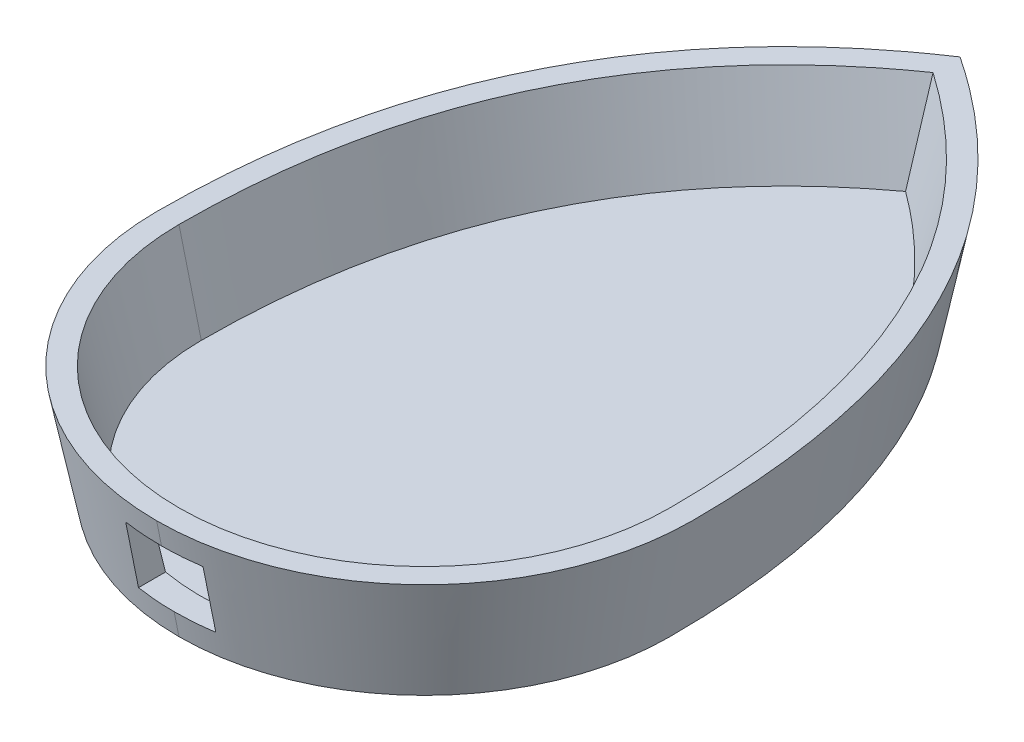
ISO-10303-21;
HEADER;
FILE_DESCRIPTION(('STEP AP214'),'2;1');
FILE_NAME('part.step','',(''),(''),'','','');
FILE_SCHEMA(('AUTOMOTIVE_DESIGN { 1 0 10303 214 1 1 1 1 }'));
ENDSEC;
DATA;
#1=APPLICATION_CONTEXT('core data for automotive mechanical design processes');
#2=APPLICATION_PROTOCOL_DEFINITION('international standard','automotive_design',2000,#1);
#3=PRODUCT_CONTEXT('',#1,'mechanical');
#4=PRODUCT('Part','Part','',(#3));
#5=PRODUCT_RELATED_PRODUCT_CATEGORY('part','',(#4));
#6=PRODUCT_DEFINITION_FORMATION('','',#4);
#7=PRODUCT_DEFINITION_CONTEXT('part definition',#1,'design');
#8=PRODUCT_DEFINITION('design','',#6,#7);
#9=PRODUCT_DEFINITION_SHAPE('','',#8);
#10=(LENGTH_UNIT() NAMED_UNIT(*) SI_UNIT(.MILLI.,.METRE.));
#11=(NAMED_UNIT(*) PLANE_ANGLE_UNIT() SI_UNIT($,.RADIAN.));
#12=(NAMED_UNIT(*) SI_UNIT($,.STERADIAN.) SOLID_ANGLE_UNIT());
#13=UNCERTAINTY_MEASURE_WITH_UNIT(LENGTH_MEASURE(1.E-05),#10,'distance_accuracy_value','');
#14=(GEOMETRIC_REPRESENTATION_CONTEXT(3) GLOBAL_UNCERTAINTY_ASSIGNED_CONTEXT((#13)) GLOBAL_UNIT_ASSIGNED_CONTEXT((#10,
#11,#12)) REPRESENTATION_CONTEXT('',''));
#15=CARTESIAN_POINT('',(0.,0.,0.));
#16=DIRECTION('',(0.,0.,1.));
#17=DIRECTION('',(1.,0.,0.));
#18=AXIS2_PLACEMENT_3D('',#15,#16,#17);
#19=CARTESIAN_POINT('',(0.,-15.875,0.));
#20=DIRECTION('',(0.,1.,0.));
#21=DIRECTION('',(0.,0.,1.));
#22=AXIS2_PLACEMENT_3D('',#19,#20,#21);
#23=PLANE('',#22);
#24=CARTESIAN_POINT('',(-34.9249999999417,-15.875,-4.7378043443898E-08));
#25=CARTESIAN_POINT('',(-34.9249999970583,-15.875,-8.0806599158788));
#26=CARTESIAN_POINT('',(-34.1867043705212,-15.875,-15.6296958282821));
#27=CARTESIAN_POINT('',(-31.2612453448167,-15.875,-29.6793205189885));
#28=CARTESIAN_POINT('',(-29.0752302143099,-15.875,-36.1800100734312));
#29=CARTESIAN_POINT('',(-23.2675325113024,-15.875,-48.1789765558001));
#30=CARTESIAN_POINT('',(-19.6460105934756,-15.875,-53.6789419478958));
#31=CARTESIAN_POINT('',(-10.9368083769806,-15.875,-63.7283287807617));
#32=CARTESIAN_POINT('',(-5.84752299816304,-15.875,-68.2783879064671));
#33=CARTESIAN_POINT('',(-4.37128631902706E-12,-15.875,-72.3587866568939));
#34=B_SPLINE_CURVE_WITH_KNOTS('',3,(#24,#25,#26,#27,#28,#29,#30,#31,#32,#33),.UNSPECIFIED.,.F.,
.F.,(4,2,2,2,4),(0.,0.25,0.5,0.75,1.),.UNSPECIFIED.);
#35=CARTESIAN_POINT('',(-34.924999999973,-15.875,-4.73900620286319E-08));
#36=VERTEX_POINT('',#35);
#37=CARTESIAN_POINT('',(2.69597712210246E-12,-15.875,-72.3587866568659));
#38=VERTEX_POINT('',#37);
#39=EDGE_CURVE('E467',#36,#38,#34,.T.);
#40=ORIENTED_EDGE('',*,*,#39,.T.);
#41=CARTESIAN_POINT('',(2.69597712210246E-12,-15.875,-72.3587866568659));
#42=CARTESIAN_POINT('',(5.84752299816165,-15.875,-68.2783879064392));
#43=CARTESIAN_POINT('',(10.9368083769786,-15.875,-63.7283287807344));
#44=CARTESIAN_POINT('',(19.6460105934742,-15.875,-53.6789419478686));
#45=CARTESIAN_POINT('',(23.2675325113017,-15.875,-48.1789765558013));
#46=CARTESIAN_POINT('',(29.0752302143098,-15.875,-36.1800100734325));
#47=CARTESIAN_POINT('',(31.2612453448168,-15.875,-29.6793205190186));
#48=CARTESIAN_POINT('',(34.1867043705216,-15.875,-15.6296958283122));
#49=CARTESIAN_POINT('',(34.9249999970588,-15.875,-8.08065991588095));
#50=CARTESIAN_POINT('',(34.9249999999424,-15.875,-4.73801918062852E-08));
#51=B_SPLINE_CURVE_WITH_KNOTS('',3,(#41,#42,#43,#44,#45,#46,#47,#48,#49,#50),.UNSPECIFIED.,.F.,
.F.,(4,2,2,2,4),(0.,0.25,0.5,0.75,1.),.UNSPECIFIED.);
#52=CARTESIAN_POINT('',(34.924999999973,-15.875,-4.73801918063267E-08));
#53=VERTEX_POINT('',#52);
#54=EDGE_CURVE('E228',#38,#53,#51,.T.);
#55=ORIENTED_EDGE('',*,*,#54,.T.);
#56=CARTESIAN_POINT('',(0.,-15.875,0.));
#57=DIRECTION('',(0.,1.,0.));
#58=DIRECTION('',(0.,0.,1.));
#59=AXIS2_PLACEMENT_3D('',#56,#57,#58);
#60=CIRCLE('',#59,34.924999999973);
#61=CARTESIAN_POINT('',(1.05424084290932E-05,-15.875,34.9250694280044));
#62=VERTEX_POINT('',#61);
#63=EDGE_CURVE('E513',#62,#53,#60,.T.);
#64=ORIENTED_EDGE('',*,*,#63,.F.);
#65=EDGE_CURVE('E518',#36,#62,#60,.T.);
#66=ORIENTED_EDGE('',*,*,#65,.F.);
#67=EDGE_LOOP('',(#40,#55,#64,#66));
#68=FACE_BOUND('',#67,.T.);
#69=ADVANCED_FACE('F131',(#68),#23,.F.);
#70=CARTESIAN_POINT('',(0.,0.,0.));
#71=DIRECTION('',(0.,1.,0.));
#72=DIRECTION('',(0.,0.,1.));
#73=AXIS2_PLACEMENT_3D('',#70,#71,#72);
#74=PLANE('',#73);
#75=CARTESIAN_POINT('',(-34.9249999999417,0.,-4.7378043443898E-08));
#76=CARTESIAN_POINT('',(-34.9249999970583,0.,-8.0806599158788));
#77=CARTESIAN_POINT('',(-34.1867043705212,0.,-15.6296958282821));
#78=CARTESIAN_POINT('',(-31.2612453448167,0.,-29.6793205189885));
#79=CARTESIAN_POINT('',(-29.0752302143099,0.,-36.1800100734312));
#80=CARTESIAN_POINT('',(-23.2675325113024,0.,-48.1789765558001));
#81=CARTESIAN_POINT('',(-19.6460105934756,0.,-53.6789419478958));
#82=CARTESIAN_POINT('',(-10.9368083769806,0.,-63.7283287807617));
#83=CARTESIAN_POINT('',(-5.84752299816304,0.,-68.2783879064671));
#84=CARTESIAN_POINT('',(-4.37128631902706E-12,0.,-72.3587866568939));
#85=B_SPLINE_CURVE_WITH_KNOTS('',3,(#75,#76,#77,#78,#79,#80,#81,#82,#83,#84),.UNSPECIFIED.,.F.,
.F.,(4,2,2,2,4),(0.,0.25,0.5,0.75,1.),.UNSPECIFIED.);
#86=CARTESIAN_POINT('',(-34.9249999999417,0.,-4.7378043443898E-08));
#87=VERTEX_POINT('',#86);
#88=CARTESIAN_POINT('',(2.69597712210246E-12,0.,-72.3587866568659));
#89=VERTEX_POINT('',#88);
#90=EDGE_CURVE('E365',#87,#89,#85,.T.);
#91=ORIENTED_EDGE('',*,*,#90,.T.);
#92=CARTESIAN_POINT('',(2.69597712210246E-12,0.,-72.3587866568659));
#93=CARTESIAN_POINT('',(5.84752299816165,0.,-68.2783879064392));
#94=CARTESIAN_POINT('',(10.9368083769786,0.,-63.7283287807344));
#95=CARTESIAN_POINT('',(19.6460105934742,0.,-53.6789419478686));
#96=CARTESIAN_POINT('',(23.2675325113017,0.,-48.1789765558013));
#97=CARTESIAN_POINT('',(29.0752302143098,0.,-36.1800100734325));
#98=CARTESIAN_POINT('',(31.2612453448168,0.,-29.6793205190186));
#99=CARTESIAN_POINT('',(34.1867043705216,0.,-15.6296958283122));
#100=CARTESIAN_POINT('',(34.9249999970588,0.,-8.08065991588095));
#101=CARTESIAN_POINT('',(34.9249999999424,0.,-4.73801918062852E-08));
#102=B_SPLINE_CURVE_WITH_KNOTS('',3,(#92,#93,#94,#95,#96,#97,#98,#99,#100,#101),.UNSPECIFIED.,
.F.,.F.,(4,2,2,2,4),(0.,0.25,0.5,0.75,1.),.UNSPECIFIED.);
#103=CARTESIAN_POINT('',(34.9250000013396,0.,-4.73801895202763E-08));
#104=VERTEX_POINT('',#103);
#105=EDGE_CURVE('E557',#89,#104,#102,.T.);
#106=ORIENTED_EDGE('',*,*,#105,.T.);
#107=CARTESIAN_POINT('',(0.,0.,0.));
#108=DIRECTION('',(0.,1.,0.));
#109=DIRECTION('',(0.,0.,1.));
#110=AXIS2_PLACEMENT_3D('',#107,#108,#109);
#111=CIRCLE('',#110,34.9249999999708);
#112=EDGE_CURVE('E369',#87,#104,#111,.T.);
#113=ORIENTED_EDGE('',*,*,#112,.F.);
#114=EDGE_LOOP('',(#91,#106,#113));
#115=FACE_BOUND('',#114,.T.);
#116=CARTESIAN_POINT('',(-38.1,0.,0.));
#117=CARTESIAN_POINT('',(-38.0999999999907,0.,-50.8720010197353));
#118=CARTESIAN_POINT('',(0.,0.,-76.2));
#119=B_SPLINE_CURVE_WITH_KNOTS('',2,(#116,#117,#118),.UNSPECIFIED.,.F.,.F.,(3,3),(0.,1.),.UNSPECIFIED.);
#120=CARTESIAN_POINT('',(-38.1,0.,0.));
#121=VERTEX_POINT('',#120);
#122=CARTESIAN_POINT('',(0.,0.,-76.2));
#123=VERTEX_POINT('',#122);
#124=EDGE_CURVE('E391',#121,#123,#119,.T.);
#125=ORIENTED_EDGE('',*,*,#124,.F.);
#126=CARTESIAN_POINT('',(0.,0.,0.));
#127=DIRECTION('',(0.,1.,0.));
#128=DIRECTION('',(0.,0.,1.));
#129=AXIS2_PLACEMENT_3D('',#126,#127,#128);
#130=CIRCLE('',#129,38.1);
#131=CARTESIAN_POINT('',(-1.16447508189885E-05,0.,38.1000826117498));
#132=VERTEX_POINT('',#131);
#133=EDGE_CURVE('E435',#121,#132,#130,.T.);
#134=ORIENTED_EDGE('',*,*,#133,.T.);
#135=CARTESIAN_POINT('',(38.1,0.,0.));
#136=VERTEX_POINT('',#135);
#137=EDGE_CURVE('E431',#132,#136,#130,.T.);
#138=ORIENTED_EDGE('',*,*,#137,.T.);
#139=CARTESIAN_POINT('',(38.1,0.,0.));
#140=CARTESIAN_POINT('',(38.0999999999907,0.,-50.8720010197353));
#141=CARTESIAN_POINT('',(0.,0.,-76.2));
#142=B_SPLINE_CURVE_WITH_KNOTS('',2,(#139,#140,#141),.UNSPECIFIED.,.F.,.F.,(3,3),(0.,1.),.UNSPECIFIED.);
#143=EDGE_CURVE('E438',#136,#123,#142,.T.);
#144=ORIENTED_EDGE('',*,*,#143,.T.);
#145=EDGE_LOOP('',(#125,#134,#138,#144));
#146=FACE_BOUND('',#145,.T.);
#147=ADVANCED_FACE('F293',(#115,#146),#74,.T.);
#148=CARTESIAN_POINT('',(-1.16447508189885E-05,0.,38.1000826117498));
#149=CARTESIAN_POINT('',(1.05424084290932E-05,-15.875,34.9250694280044));
#150=CARTESIAN_POINT('',(-2.5006763266818,0.,38.1000818475055));
#151=CARTESIAN_POINT('',(-2.2793612818631,-15.875,34.9250701160121));
#152=CARTESIAN_POINT('',(-7.50200541410691,0.,37.6060478398604));
#153=CARTESIAN_POINT('',(-6.83810517586723,-15.875,34.47739058703));
#154=CARTESIAN_POINT('',(-14.7121354004322,0.,35.4123242086588));
#155=CARTESIAN_POINT('',(-13.4166571822769,-15.875,32.4877802144078));
#156=CARTESIAN_POINT('',(-21.3505349515148,0.,31.8529341765999));
#157=CARTESIAN_POINT('',(-19.485401622336,-15.875,29.2541060853564));
#158=CARTESIAN_POINT('',(-27.1606563057038,0.,27.0687496488763));
#159=CARTESIAN_POINT('',(-24.8123902609882,-15.875,24.896940942448));
#160=CARTESIAN_POINT('',(-31.9198698056499,0.,21.2484943818256));
#161=CARTESIAN_POINT('',(-29.1925294234042,-15.875,19.5792651114903));
#162=CARTESIAN_POINT('',(-35.4478753605464,0.,14.6206989560948));
#163=CARTESIAN_POINT('',(-32.4549102472117,-15.875,13.5008883926727));
#164=CARTESIAN_POINT('',(-37.6144093224181,0.,7.44422045676078));
#165=CARTESIAN_POINT('',(-34.4697575355005,-15.875,6.89145456004415));
#166=CARTESIAN_POINT('',(-38.1,0.,2.47966981217265));
#167=CARTESIAN_POINT('',(-34.9250000030923,-15.875,2.29884491137398));
#168=CARTESIAN_POINT('',(-38.0999999999993,0.,-3.74024455626681));
#169=CARTESIAN_POINT('',(-34.9249999987044,-15.875,-3.46749016184549));
#170=CARTESIAN_POINT('',(-37.7915670600429,0.,-11.2113587655299));
#171=CARTESIAN_POINT('',(-34.6535709504633,-15.875,-10.4161971714796));
#172=CARTESIAN_POINT('',(-36.2523479356984,0.,-22.2784776192415));
#173=CARTESIAN_POINT('',(-33.2836840678143,-15.875,-20.7924072190926));
#174=CARTESIAN_POINT('',(-33.4852882023996,0.,-33.094616262399));
#175=CARTESIAN_POINT('',(-30.7997320887285,-15.875,-30.989670868036));
#176=CARTESIAN_POINT('',(-29.3695733379445,0.,-43.4501477878273));
#177=CARTESIAN_POINT('',(-27.0726196112731,-15.875,-40.8244945735413));
#178=CARTESIAN_POINT('',(-23.8613940974803,0.,-53.1339994359898));
#179=CARTESIAN_POINT('',(-22.0446121700157,-15.875,-50.0776306073177));
#180=CARTESIAN_POINT('',(-17.0273947450351,0.,-61.9264738868761));
#181=CARTESIAN_POINT('',(-15.7600058866834,-15.875,-58.531443293637));
#182=CARTESIAN_POINT('',(-9.03801875405662,0.,-69.6886258517783));
#183=CARTESIAN_POINT('',(-8.37585996202627,-15.875,-66.0334188936042));
#184=CARTESIAN_POINT('',(-3.0915217248225,0.,-74.1448278453074));
#185=CARTESIAN_POINT('',(-2.86494956965829,-15.875,-70.3596262178956));
#186=CARTESIAN_POINT('',(0.,0.,-76.2));
#187=CARTESIAN_POINT('',(-4.37128631902706E-12,-15.875,-72.3587866568939));
#188=B_SPLINE_SURFACE_WITH_KNOTS('',3,1,((#148,#149),(#150,#151),(#152,#153),(#154,#155),(#156,
#157),(#158,#159),(#160,#161),(#162,#163),(#164,#165),(#166,#167),(#168,#169),(#170,#171),(#172,
#173),(#174,#175),(#176,#177),(#178,#179),(#180,#181),(#182,#183),(#184,#185),(#186,#187)),
.UNSPECIFIED.,.F.,.F.,.F.,(4,1,1,1,1,1,1,1,2,1,1,1,1,1,1,1,4),(2,2),(0.499999730145373,
0.524916422345061,0.54983311454475,0.574749806744438,0.599666498944127,0.624583191143815,
0.649499883343504,0.674416575543193,0.699333267742881,0.736916609275021,0.774499950807161,
0.812083292339301,0.84966663387144,0.88724997540358,0.92483331693572,0.96241665846786,1.),(0.,
1.),.UNSPECIFIED.);
#189=CARTESIAN_POINT('',(-6.82856494378286E-06,-3.44599999999999,37.4108797499428));
#190=CARTESIAN_POINT('',(-0.184246986337074,-3.44599999999999,37.4108797165838));
#191=CARTESIAN_POINT('',(-0.368487084724106,-3.44599999999999,37.4095141743059));
#192=CARTESIAN_POINT('',(-0.736766661582786,-3.44599999999999,37.404058473425));
#193=CARTESIAN_POINT('',(-0.920806175170771,-3.44599999999999,37.3999706856272));
#194=CARTESIAN_POINT('',(-1.288684886784,-3.44599999999999,37.3890804262643));
#195=CARTESIAN_POINT('',(-1.47252413720962,-3.44599999999999,37.382279724308));
#196=CARTESIAN_POINT('',(-1.84000259661935,-3.44599999999999,37.3659711691489));
#197=CARTESIAN_POINT('',(-2.02364185778791,-3.44599999999999,37.3564644917079));
#198=CARTESIAN_POINT('',(-2.39072053136002,-3.44599999999999,37.3347491380308));
#199=CARTESIAN_POINT('',(-2.57415997849973,-3.44599999999999,37.3225410489452));
#200=CARTESIAN_POINT('',(-2.94083902609209,-3.44599999999999,37.2954256650221));
#201=CARTESIAN_POINT('',(-3.12407862680399,-3.44599999999999,37.2805183736902));
#202=CARTESIAN_POINT('',(-3.49035849564844,-3.44599999999999,37.2480049677));
#203=CARTESIAN_POINT('',(-3.67339871161958,-3.44599999999999,37.2303982654198));
#204=CARTESIAN_POINT('',(-4.03927960658436,-3.44599999999999,37.1924840866407));
#205=CARTESIAN_POINT('',(-4.22212016431588,-3.44599999999999,37.1721754399262));
#206=CARTESIAN_POINT('',(-4.58760129857424,-3.44599999999999,37.1288530649041));
#207=CARTESIAN_POINT('',(-4.77024166728159,-3.44599999999999,37.1058375833166));
#208=CARTESIAN_POINT('',(-5.13532171637687,-3.44599999999999,37.0570948595614));
#209=CARTESIAN_POINT('',(-5.31776108449613,-3.44599999999999,37.0313652785243));
#210=CARTESIAN_POINT('',(-5.50000055117118,-3.44599999999999,37.0042900122708));
#211=B_SPLINE_CURVE_WITH_KNOTS('',3,(#189,#190,#191,#192,#193,#194,#195,#196,#197,#198,#199,
#200,#201,#202,#203,#204,#205,#206,#207,#208,#209,#210),.UNSPECIFIED.,.F.,.F.,(4,2,2,2,2,2,2,2,
2,2,4),(0.,0.552715325493651,1.10494991927935,1.65682488301088,2.20846041900882,
2.75997617486268,3.31149121441346,3.86312648152588,4.41500144506157,4.9672358602331,
5.51995011129016),.UNSPECIFIED.);
#212=CARTESIAN_POINT('',(-6.82856494378286E-06,-3.44599999999999,37.4108797499428));
#213=VERTEX_POINT('',#212);
#214=CARTESIAN_POINT('',(-5.50000055117119,-3.44599999999999,37.0042900122708));
#215=VERTEX_POINT('',#214);
#216=EDGE_CURVE('E283',#213,#215,#211,.T.);
#217=DIRECTION('',(1.37047534692936E-06,-0.980580519084914,-0.196116918161799));
#218=VECTOR('',#217,1.);
#219=CARTESIAN_POINT('',(-5.51171194947651E-07,-7.93749999999999,36.5125760198771));
#220=LINE('',#219,#218);
#221=EDGE_CURVE('E135',#132,#213,#220,.T.);
#222=DIRECTION('',(1.65062061383563E-13,-0.971951951291255,0.235179515224267));
#223=VECTOR('',#222,1.);
#224=CARTESIAN_POINT('',(1.34798856105123E-12,-7.9375,-74.2793933284329));
#225=LINE('',#224,#223);
#226=EDGE_CURVE('E460',#123,#38,#225,.T.);
#227=CARTESIAN_POINT('',(5.74998203150753E-06,-12.446,35.6108722756934));
#228=VERTEX_POINT('',#227);
#229=EDGE_CURVE('E487',#228,#62,#220,.T.);
#230=CARTESIAN_POINT('',(-5.50000055117119,-12.446,35.1835166013479));
#231=CARTESIAN_POINT('',(-5.31787552812141,-12.446,35.2119759047821));
#232=CARTESIAN_POINT('',(-5.13552955766871,-12.446,35.2390210281903));
#233=CARTESIAN_POINT('',(-4.77061495701603,-12.446,35.2902539947404));
#234=CARTESIAN_POINT('',(-4.58804670799859,-12.446,35.3144445529047));
#235=CARTESIAN_POINT('',(-4.22268869237352,-12.446,35.3599776918222));
#236=CARTESIAN_POINT('',(-4.03989917933421,-12.446,35.3813223072805));
#237=CARTESIAN_POINT('',(-3.6740994142192,-12.446,35.4211701317088));
#238=CARTESIAN_POINT('',(-3.49108931005656,-12.446,35.4396746985227));
#239=CARTESIAN_POINT('',(-3.12484880883077,-12.446,35.4738462798378));
#240=CARTESIAN_POINT('',(-2.94161847538678,-12.446,35.4895139761897));
#241=CARTESIAN_POINT('',(-2.5749371328408,-12.446,35.518013002952));
#242=CARTESIAN_POINT('',(-2.39148612347058,-12.446,35.5308443299113));
#243=CARTESIAN_POINT('',(-2.02436343938778,-12.446,35.5536690197446));
#244=CARTESIAN_POINT('',(-1.84069172228617,-12.446,35.5636617008511));
#245=CARTESIAN_POINT('',(-1.47312744200266,-12.446,35.5808047877443));
#246=CARTESIAN_POINT('',(-1.28923481516034,-12.446,35.5879538287079));
#247=CARTESIAN_POINT('',(-0.921228395243226,-12.446,35.5994025929828));
#248=CARTESIAN_POINT('',(-0.737114538243315,-12.446,35.6037002620879));
#249=CARTESIAN_POINT('',(-0.368665254702297,-12.446,35.609436496566));
#250=CARTESIAN_POINT('',(-0.184329785312928,-12.446,35.6108723093519));
#251=CARTESIAN_POINT('',(5.74998203150753E-06,-12.446,35.6108722756934));
#252=B_SPLINE_CURVE_WITH_KNOTS('',3,(#230,#231,#232,#233,#234,#235,#236,#237,#238,#239,#240,
#241,#242,#243,#244,#245,#246,#247,#248,#249,#250,#251),.UNSPECIFIED.,.F.,.F.,(4,2,2,2,2,2,2,2,
2,2,4),(0.,0.552999908847149,1.10546953742586,1.65754203563347,2.20934975697288,
2.76102467303805,3.31270026032076,3.86450823365901,4.4165807320678,4.96905052795573,
5.52205144371725),.UNSPECIFIED.);
#253=CARTESIAN_POINT('',(-5.50000055117119,-12.446,35.1835166013479));
#254=VERTEX_POINT('',#253);
#255=EDGE_CURVE('E149',#254,#228,#252,.T.);
#256=CARTESIAN_POINT('',(-5.50000055117119,-3.44599999999999,37.0042900122708));
#257=CARTESIAN_POINT('',(-5.50000055117118,-4.7800955661851,36.7345451926733));
#258=CARTESIAN_POINT('',(-5.50000055117118,-6.11417785801719,36.4647347564883));
#259=CARTESIAN_POINT('',(-5.50000055117119,-9.11418528386928,35.8578469929846));
#260=CARTESIAN_POINT('',(-5.50000055117119,-10.7801029920372,35.520732958862));
#261=CARTESIAN_POINT('',(-5.50000055117119,-12.446,35.1835166013479));
#262=B_SPLINE_CURVE_WITH_KNOTS('',3,(#256,#257,#258,#259,#260,#261),.UNSPECIFIED.,.F.,.F.,(4,2,
4),(0.,4.08327798413099,9.18233173375048),.UNSPECIFIED.);
#263=EDGE_CURVE('E235',#215,#254,#262,.T.);
#264=ORIENTED_EDGE('',*,*,#216,.F.);
#265=ORIENTED_EDGE('',*,*,#221,.F.);
#266=ORIENTED_EDGE('',*,*,#133,.F.);
#267=ORIENTED_EDGE('',*,*,#124,.T.);
#268=ORIENTED_EDGE('',*,*,#226,.T.);
#269=ORIENTED_EDGE('',*,*,#39,.F.);
#270=ORIENTED_EDGE('',*,*,#65,.T.);
#271=ORIENTED_EDGE('',*,*,#229,.F.);
#272=ORIENTED_EDGE('',*,*,#255,.F.);
#273=ORIENTED_EDGE('',*,*,#263,.F.);
#274=EDGE_LOOP('',(#264,#265,#266,#267,#268,#269,#270,#271,#272,#273));
#275=FACE_BOUND('',#274,.T.);
#276=ADVANCED_FACE('F291',(#275),#188,.T.);
#277=CARTESIAN_POINT('',(0.,0.,-76.2));
#278=CARTESIAN_POINT('',(2.69597712210246E-12,-15.875,-72.3587866568659));
#279=CARTESIAN_POINT('',(3.09151615742061,0.,-74.1448315463874));
#280=CARTESIAN_POINT('',(2.86495461566893,-15.875,-70.3596226967627));
#281=CARTESIAN_POINT('',(9.0380065476364,0.,-69.68863576575));
#282=CARTESIAN_POINT('',(8.3758712042324,-15.875,-66.0334093410053));
#283=CARTESIAN_POINT('',(17.027381771407,0.,-61.9264883538794));
#284=CARTESIAN_POINT('',(15.7600177057493,-15.875,-58.5314295052452));
#285=CARTESIAN_POINT('',(23.8613853315765,0.,-53.1340130502761));
#286=CARTESIAN_POINT('',(22.0446200707034,-15.875,-50.0776177569457));
#287=CARTESIAN_POINT('',(29.3695698421399,0.,-43.4501560226402));
#288=CARTESIAN_POINT('',(27.0726226843438,-15.875,-40.8244869694736));
#289=CARTESIAN_POINT('',(33.4852883317019,0.,-33.0946168993894));
#290=CARTESIAN_POINT('',(30.7997318992672,-15.875,-30.9896704612834));
#291=CARTESIAN_POINT('',(36.2523492834733,0.,-22.2784717627695));
#292=CARTESIAN_POINT('',(33.2836828850422,-15.875,-20.7924127841974));
#293=CARTESIAN_POINT('',(37.791567644687,0.,-11.2113509596906));
#294=CARTESIAN_POINT('',(34.6535704096257,-15.875,-10.4162044092849));
#295=CARTESIAN_POINT('',(38.0999999999993,0.,-3.74024070712721));
#296=CARTESIAN_POINT('',(34.924999998705,-15.875,-3.46749358100375));
#297=CARTESIAN_POINT('',(38.1,0.,2.47967172585361));
#298=CARTESIAN_POINT('',(34.9250000030916,-15.875,2.29884312925108));
#299=CARTESIAN_POINT('',(37.6144085707333,0.,7.44422596788306));
#300=CARTESIAN_POINT('',(34.4697582428228,-15.875,6.89144945360764));
#301=CARTESIAN_POINT('',(35.4478717008629,0.,14.6207085808999));
#302=CARTESIAN_POINT('',(32.4549136448581,-15.875,13.500879544846));
#303=CARTESIAN_POINT('',(31.9198620673966,0.,21.2485064409218));
#304=CARTESIAN_POINT('',(29.1925365499511,-15.875,19.5792540971518));
#305=CARTESIAN_POINT('',(27.1606439900781,0.,27.0687622803211));
#306=CARTESIAN_POINT('',(24.8124015320667,-15.8749999999999,24.8969294664905));
#307=CARTESIAN_POINT('',(21.3505182302502,0.,31.8529455600342));
#308=CARTESIAN_POINT('',(19.4854168515847,-15.8750000000001,29.2540957869111));
#309=CARTESIAN_POINT('',(14.7121150468953,0.,35.4123327700514));
#310=CARTESIAN_POINT('',(13.4166756559033,-15.8749999999999,32.4877724927082));
#311=CARTESIAN_POINT('',(7.50198267747897,0.,37.6060524253265));
#312=CARTESIAN_POINT('',(6.83812576976192,-15.8750000000001,34.4773864589837));
#313=CARTESIAN_POINT('',(2.50065303718016,0.,38.1000833759942));
#314=CARTESIAN_POINT('',(2.27938236667996,-15.875,34.9250687399967));
#315=CARTESIAN_POINT('',(-1.16447508189885E-05,0.,38.1000826117498));
#316=CARTESIAN_POINT('',(1.05424084290932E-05,-15.875,34.9250694280044));
#317=B_SPLINE_SURFACE_WITH_KNOTS('',3,1,((#277,#278),(#279,#280),(#281,#282),(#283,#284),(#285,
#286),(#287,#288),(#289,#290),(#291,#292),(#293,#294),(#295,#296),(#297,#298),(#299,#300),(#301,
#302),(#303,#304),(#305,#306),(#307,#308),(#309,#310),(#311,#312),(#313,#314),(#315,#316)),
.UNSPECIFIED.,.F.,.F.,.F.,(4,1,1,1,1,1,1,1,2,1,1,1,1,1,1,1,4),(2,2),(0.,0.0375832740684831,
0.0751665481369662,0.112749822205449,0.150333096273932,0.187916370342416,0.225499644410899,
0.263082918479382,0.300666192547865,0.325582884747553,0.350499576947242,0.37541626914693,
0.400332961346619,0.425249653546307,0.450166345745996,0.475083037945684,0.499999730145373),(0.,
1.),.UNSPECIFIED.);
#318=CARTESIAN_POINT('',(5.49999944882881,-3.44599999999999,37.0042901829691));
#319=CARTESIAN_POINT('',(5.31775956616703,-3.44599999999999,37.0313655052496));
#320=CARTESIAN_POINT('',(5.13531978118873,-3.44599999999999,37.057095136152));
#321=CARTESIAN_POINT('',(4.77023889798923,-3.44599999999999,37.1058379471694));
#322=CARTESIAN_POINT('',(4.58759811203939,-3.44599999999999,37.1288534661752));
#323=CARTESIAN_POINT('',(4.22211614291862,-3.44599999999999,37.1721759036465));
#324=CARTESIAN_POINT('',(4.0392751675689,-3.44599999999999,37.1924845754079));
#325=CARTESIAN_POINT('',(3.67339343699634,-3.44599999999999,37.2303987919536));
#326=CARTESIAN_POINT('',(3.49035280303657,-3.44599999999999,37.2480055069639));
#327=CARTESIAN_POINT('',(3.12407209784736,-3.44599999999999,37.2805189261251));
#328=CARTESIAN_POINT('',(2.94083207877971,-3.44599999999999,37.2954262179032));
#329=CARTESIAN_POINT('',(2.57415219410731,-3.44599999999999,37.3225415904464));
#330=CARTESIAN_POINT('',(2.39071232824332,-3.44599999999999,37.3347496677058));
#331=CARTESIAN_POINT('',(2.02363281685299,-3.44599999999999,37.3564649854532));
#332=CARTESIAN_POINT('',(1.83999313659031,-3.44599999999999,37.3659716387855));
#333=CARTESIAN_POINT('',(1.47251383862267,-3.44599999999999,37.3822801334232));
#334=CARTESIAN_POINT('',(1.28867416873311,-3.44599999999999,37.3890807989561));
#335=CARTESIAN_POINT('',(0.920794617821901,-3.44599999999999,37.39997097312));
#336=CARTESIAN_POINT('',(0.736754684399938,-3.44599999999999,37.4040587121259));
#337=CARTESIAN_POINT('',(0.368474267502801,-3.44599999999999,37.4095143030001));
#338=CARTESIAN_POINT('',(0.18423374891176,-3.44599999999999,37.4108797840415));
#339=CARTESIAN_POINT('',(-6.82856494378286E-06,-3.44599999999999,37.4108797499428));
#340=B_SPLINE_CURVE_WITH_KNOTS('',3,(#318,#319,#320,#321,#322,#323,#324,#325,#326,#327,#328,
#329,#330,#331,#332,#333,#334,#335,#336,#337,#338,#339),.UNSPECIFIED.,.F.,.F.,(4,2,2,2,2,2,2,2,
2,2,4),(0.,0.552715510133457,1.10495118110852,1.65682739800032,2.20846391683842,
2.75998020729683,3.31149721405958,3.86313400178367,4.41501021887131,4.96724606846085,
5.51996265303285),.UNSPECIFIED.);
#341=CARTESIAN_POINT('',(5.49999944882881,-3.44599999999999,37.0042901829691));
#342=VERTEX_POINT('',#341);
#343=EDGE_CURVE('E281',#342,#213,#340,.T.);
#344=CARTESIAN_POINT('',(5.49999944882881,-12.446,35.1835167795871));
#345=CARTESIAN_POINT('',(5.49999944882881,-11.1119643033054,35.4535575329552));
#346=CARTESIAN_POINT('',(5.49999944882881,-9.77791525744571,35.7235323040966));
#347=CARTESIAN_POINT('',(5.49999944882881,-6.77792272514869,36.3304936832379));
#348=CARTESIAN_POINT('',(5.49999944882881,-5.1119717710084,36.6674433798906));
#349=CARTESIAN_POINT('',(5.49999944882881,-3.44599999999999,37.0042901829691));
#350=B_SPLINE_CURVE_WITH_KNOTS('',3,(#344,#345,#346,#347,#348,#349),.UNSPECIFIED.,.F.,.F.,(4,2,
4),(0.,4.08327798518644,9.18233173241027),.UNSPECIFIED.);
#351=CARTESIAN_POINT('',(5.49999944882881,-12.446,35.1835167795871));
#352=VERTEX_POINT('',#351);
#353=EDGE_CURVE('E347',#352,#342,#350,.T.);
#354=CARTESIAN_POINT('',(5.74998203150753E-06,-12.446,35.6108722756934));
#355=CARTESIAN_POINT('',(0.184340862924931,-12.446,35.6108722500519));
#356=CARTESIAN_POINT('',(0.368675909500936,-12.446,35.6094363845456));
#357=CARTESIAN_POINT('',(0.737124348012666,-12.446,35.6037000578014));
#358=CARTESIAN_POINT('',(0.921237782797047,-12.446,35.5994023491254));
#359=CARTESIAN_POINT('',(1.28924335888028,-12.446,35.5879535187902));
#360=CARTESIAN_POINT('',(1.47313556410418,-12.446,35.5808044513184));
#361=CARTESIAN_POINT('',(1.84069900174746,-12.446,35.5636613244231));
#362=CARTESIAN_POINT('',(2.02437029782699,-12.446,35.5536686298101));
#363=CARTESIAN_POINT('',(2.39149214046187,-12.446,35.5308439259358));
#364=CARTESIAN_POINT('',(2.57494272940601,-12.446,35.5180125984359));
#365=CARTESIAN_POINT('',(2.94162323169349,-12.446,35.4895135835476));
#366=CARTESIAN_POINT('',(3.12485314530506,-12.446,35.4738458996103));
#367=CARTESIAN_POINT('',(3.49109280745819,-12.446,35.439674356088));
#368=CARTESIAN_POINT('',(3.67410249238109,-12.446,35.4211698146585));
#369=CARTESIAN_POINT('',(4.03990141961232,-12.446,35.3813220539954));
#370=CARTESIAN_POINT('',(4.22269051400885,-12.446,35.3599774769304));
#371=CARTESIAN_POINT('',(4.58804769294999,-12.446,35.3144444278534));
#372=CARTESIAN_POINT('',(4.77061552392852,-12.446,35.2902539211551));
#373=CARTESIAN_POINT('',(5.13552928911384,-12.446,35.2390210706734));
#374=CARTESIAN_POINT('',(5.31787484214157,-12.446,35.2119760118927));
#375=CARTESIAN_POINT('',(5.49999944882881,-12.446,35.1835167795871));
#376=B_SPLINE_CURVE_WITH_KNOTS('',3,(#354,#355,#356,#357,#358,#359,#360,#361,#362,#363,#364,
#365,#366,#367,#368,#369,#370,#371,#372,#373,#374,#375),.UNSPECIFIED.,.F.,.F.,(4,2,2,2,2,2,2,2,
2,2,4),(0.,0.552999648744664,1.10546818125361,1.6575394190024,2.20934613349141,2.76102046283333,
3.31269412095793,3.86450058344821,4.41657182099581,4.96904018619559,5.52203882802631),.UNSPECIFIED.);
#377=EDGE_CURVE('E778',#228,#352,#376,.T.);
#378=ORIENTED_EDGE('',*,*,#343,.F.);
#379=ORIENTED_EDGE('',*,*,#353,.F.);
#380=ORIENTED_EDGE('',*,*,#377,.F.);
#381=ORIENTED_EDGE('',*,*,#229,.T.);
#382=ORIENTED_EDGE('',*,*,#63,.T.);
#383=ORIENTED_EDGE('',*,*,#54,.F.);
#384=ORIENTED_EDGE('',*,*,#226,.F.);
#385=ORIENTED_EDGE('',*,*,#143,.F.);
#386=ORIENTED_EDGE('',*,*,#137,.F.);
#387=ORIENTED_EDGE('',*,*,#221,.T.);
#388=EDGE_LOOP('',(#378,#379,#380,#381,#382,#383,#384,#385,#386,#387));
#389=FACE_BOUND('',#388,.T.);
#390=ADVANCED_FACE('F284',(#389),#317,.T.);
#391=CARTESIAN_POINT('',(-23.7619501338521,-12.7,-39.8529072511385));
#392=DIRECTION('',(0.,1.,0.));
#393=DIRECTION('',(0.,0.,1.));
#394=AXIS2_PLACEMENT_3D('',#391,#392,#393);
#395=PLANE('',#394);
#396=CARTESIAN_POINT('',(-1.98296240538909E-11,-12.7,-68.4529759866343));
#397=CARTESIAN_POINT('',(-5.33390892302241,-12.7,-64.5270815526113));
#398=CARTESIAN_POINT('',(-9.9521595216957,-12.7,-60.1923250399934));
#399=CARTESIAN_POINT('',(-17.847563890764,-12.7,-50.6798470691456));
#400=CARTESIAN_POINT('',(-21.1256281476067,-12.7,-45.5012166394209));
#401=CARTESIAN_POINT('',(-26.3982721200974,-12.7,-34.2045978628561));
#402=CARTESIAN_POINT('',(-28.3909841035768,-12.7,-28.0850527720324));
#403=CARTESIAN_POINT('',(-31.0679728976468,-12.7,-14.8189318222968));
#404=CARTESIAN_POINT('',(-31.7499999972038,-12.7,-7.67269847508802));
#405=CARTESIAN_POINT('',(-31.7499999999417,-12.7,-4.62451160561983E-08));
#406=B_SPLINE_CURVE_WITH_KNOTS('',3,(#396,#397,#398,#399,#400,#401,#402,#403,#404,#405),
.UNSPECIFIED.,.F.,.F.,(4,2,2,2,4),(0.,0.25,0.5,0.75,1.),.UNSPECIFIED.);
#407=CARTESIAN_POINT('',(-1.98296240538909E-11,-12.7,-68.4529759866343));
#408=VERTEX_POINT('',#407);
#409=CARTESIAN_POINT('',(-31.749999999942,-12.7,-4.62451155739009E-08));
#410=VERTEX_POINT('',#409);
#411=EDGE_CURVE('E641',#408,#410,#406,.T.);
#412=ORIENTED_EDGE('',*,*,#411,.T.);
#413=CARTESIAN_POINT('',(0.,-12.7,0.));
#414=DIRECTION('',(0.,1.,0.));
#415=DIRECTION('',(0.,0.,1.));
#416=AXIS2_PLACEMENT_3D('',#413,#414,#415);
#417=CIRCLE('',#416,31.749999999942);
#418=CARTESIAN_POINT('',(31.7499999999424,-12.7,-4.62471908061962E-08));
#419=VERTEX_POINT('',#418);
#420=EDGE_CURVE('E388',#410,#419,#417,.T.);
#421=ORIENTED_EDGE('',*,*,#420,.T.);
#422=CARTESIAN_POINT('',(31.7499999999424,-12.7,-4.62471908061962E-08));
#423=CARTESIAN_POINT('',(31.7499999972044,-12.7,-7.6726984750947));
#424=CARTESIAN_POINT('',(31.0679728976462,-12.7,-14.8189318223355));
#425=CARTESIAN_POINT('',(28.3909841035732,-12.7,-28.0850527720777));
#426=CARTESIAN_POINT('',(26.3982721200926,-12.7,-34.2045978628748));
#427=CARTESIAN_POINT('',(21.1256281475925,-12.7,-45.5012166394442));
#428=CARTESIAN_POINT('',(17.8475638907501,-12.7,-50.6798470691425));
#429=CARTESIAN_POINT('',(9.95215952166587,-12.7,-60.192325039992));
#430=CARTESIAN_POINT('',(5.33390892298943,-12.7,-64.5270815526111));
#431=CARTESIAN_POINT('',(-1.98116262978276E-11,-12.7,-68.4529759866343));
#432=B_SPLINE_CURVE_WITH_KNOTS('',3,(#422,#423,#424,#425,#426,#427,#428,#429,#430,#431),
.UNSPECIFIED.,.F.,.F.,(4,2,2,2,4),(0.,0.25,0.5,0.75,1.),.UNSPECIFIED.);
#433=EDGE_CURVE('E392',#419,#408,#432,.T.);
#434=ORIENTED_EDGE('',*,*,#433,.T.);
#435=EDGE_LOOP('',(#412,#421,#434));
#436=FACE_BOUND('',#435,.T.);
#437=ADVANCED_FACE('F290',(#436),#395,.T.);
#438=CARTESIAN_POINT('',(-34.9249999999417,0.,-4.7378043443898E-08));
#439=CARTESIAN_POINT('',(-31.7499999999417,-12.7,-4.62451160561983E-08));
#440=CARTESIAN_POINT('',(-34.9249999970583,0.,-8.0806599158788));
#441=CARTESIAN_POINT('',(-31.7499999972038,-12.7,-7.67269847508802));
#442=CARTESIAN_POINT('',(-34.1867043705212,0.,-15.6296958282821));
#443=CARTESIAN_POINT('',(-31.0679728976468,-12.7,-14.8189318222968));
#444=CARTESIAN_POINT('',(-31.2612453448167,0.,-29.6793205189885));
#445=CARTESIAN_POINT('',(-28.3909841035768,-12.7,-28.0850527720324));
#446=CARTESIAN_POINT('',(-29.0752302143099,0.,-36.1800100734312));
#447=CARTESIAN_POINT('',(-26.3982721200974,-12.7,-34.2045978628561));
#448=CARTESIAN_POINT('',(-23.2675325113024,0.,-48.1789765558001));
#449=CARTESIAN_POINT('',(-21.1256281476067,-12.7,-45.5012166394209));
#450=CARTESIAN_POINT('',(-19.6460105934756,0.,-53.6789419478958));
#451=CARTESIAN_POINT('',(-17.847563890764,-12.7,-50.6798470691456));
#452=CARTESIAN_POINT('',(-10.9368083769806,0.,-63.7283287807617));
#453=CARTESIAN_POINT('',(-9.9521595216957,-12.7,-60.1923250399934));
#454=CARTESIAN_POINT('',(-5.84752299816304,0.,-68.2783879064671));
#455=CARTESIAN_POINT('',(-5.33390892302241,-12.7,-64.5270815526113));
#456=CARTESIAN_POINT('',(-4.37128631902706E-12,0.,-72.3587866568939));
#457=CARTESIAN_POINT('',(-1.98296240538909E-11,-12.7,-68.4529759866343));
#458=B_SPLINE_SURFACE_WITH_KNOTS('',3,1,((#438,#439),(#440,#441),(#442,#443),(#444,#445),(#446,
#447),(#448,#449),(#450,#451),(#452,#453),(#454,#455),(#456,#457)),.UNSPECIFIED.,.F.,.F.,.F.,(4,
2,2,2,4),(2,2),(0.,0.25,0.5,0.75,1.),(0.,1.),.UNSPECIFIED.);
#459=DIRECTION('',(-0.242535625036333,0.970142500145332,-8.65433864870944E-11));
#460=VECTOR('',#459,1.);
#461=CARTESIAN_POINT('',(-33.3374999999417,-6.35,-4.68115797500481E-08));
#462=LINE('',#461,#460);
#463=EDGE_CURVE('E584',#410,#87,#462,.T.);
#464=DIRECTION('',(-1.16341495299494E-12,-0.955818805130145,0.293956479363156));
#465=VECTOR('',#464,1.);
#466=CARTESIAN_POINT('',(-1.2100455186459E-11,-6.35,-70.4058813217641));
#467=LINE('',#466,#465);
#468=EDGE_CURVE('E643',#89,#408,#467,.T.);
#469=ORIENTED_EDGE('',*,*,#90,.F.);
#470=ORIENTED_EDGE('',*,*,#463,.F.);
#471=ORIENTED_EDGE('',*,*,#411,.F.);
#472=ORIENTED_EDGE('',*,*,#468,.F.);
#473=EDGE_LOOP('',(#469,#470,#471,#472));
#474=FACE_BOUND('',#473,.T.);
#475=ADVANCED_FACE('F413',(#474),#458,.F.);
#476=CARTESIAN_POINT('',(2.69597712210246E-12,0.,-72.3587866568659));
#477=CARTESIAN_POINT('',(-1.98116262978276E-11,-12.7,-68.4529759866343));
#478=CARTESIAN_POINT('',(2.88943085050558,0.,-70.3425431918041));
#479=CARTESIAN_POINT('',(2.61385225895029,-12.7,-66.5291133592499));
#480=CARTESIAN_POINT('',(8.42136724971189,0.,-65.9937002816162));
#481=CARTESIAN_POINT('',(7.64383436817273,-12.7,-62.3760023340837));
#482=CARTESIAN_POINT('',(15.7868845431502,0.,-58.4969472165698));
#483=CARTESIAN_POINT('',(14.3779056527329,-12.7,-55.207258561343));
#484=CARTESIAN_POINT('',(22.0357523877565,0.,-50.0862694595943));
#485=CARTESIAN_POINT('',(20.0978768501316,-12.7,-47.1646605092538));
#486=CARTESIAN_POINT('',(27.0361214155005,0.,-40.8956586614521));
#487=CARTESIAN_POINT('',(24.659576414807,-12.6999999999999,-38.3956179123011));
#488=CARTESIAN_POINT('',(30.756990747616,0.,-31.124330057876));
#489=CARTESIAN_POINT('',(28.0321297575862,-12.7000000000001,-29.1081053839018));
#490=CARTESIAN_POINT('',(33.2533371387469,0.,-20.9517359713852));
#491=CARTESIAN_POINT('',(30.2729763266468,-12.7,-19.5051447171138));
#492=CARTESIAN_POINT('',(34.6451508657709,0.,-10.5514338427108));
#493=CARTESIAN_POINT('',(31.5064448685615,-12.7,-9.75782399490726));
#494=CARTESIAN_POINT('',(34.9249999986851,0.,-3.52335758675113));
#495=CARTESIAN_POINT('',(31.7499999987842,-12.7,-3.24553097981869));
#496=CARTESIAN_POINT('',(34.9250000030516,0.,2.27091126084544));
#497=CARTESIAN_POINT('',(31.750000002989,-12.7,2.09185152059234));
#498=CARTESIAN_POINT('',(34.480696291257,0.,6.81829057429751));
#499=CARTESIAN_POINT('',(31.3353588200452,-12.7,6.27015732069651));
#500=CARTESIAN_POINT('',(32.4971077133118,0.,13.3941419480056));
#501=CARTESIAN_POINT('',(29.5014644874402,-12.7,12.2810781168144));
#502=CARTESIAN_POINT('',(29.2654579312587,0.,19.4693106323346));
#503=CARTESIAN_POINT('',(26.5335076267753,-12.7,17.8070670514553));
#504=CARTESIAN_POINT('',(24.9043421110314,0.,24.8060080615614));
#505=CARTESIAN_POINT('',(22.5502463117513,-12.7,22.6399554574419));
#506=CARTESIAN_POINT('',(19.5784861941988,0.,29.1938710301266));
#507=CARTESIAN_POINT('',(17.7074724443933,-12.7,26.5988499928364));
#508=CARTESIAN_POINT('',(13.4919211638857,0.,32.459081124667));
#509=CARTESIAN_POINT('',(12.1916970495833,-12.7,29.5363450807744));
#510=CARTESIAN_POINT('',(6.88006310102261,0.,34.4717791540508));
#511=CARTESIAN_POINT('',(6.21353373472683,-12.7,31.3434714918827));
#512=CARTESIAN_POINT('',(1.08767161943746E-12,0.,35.1517239998525));
#513=CARTESIAN_POINT('',(1.08333481074752E-12,-12.7,31.9533582834584));
#514=CARTESIAN_POINT('',(-6.88006310102047,0.,34.4717791540513));
#515=CARTESIAN_POINT('',(-6.21353373472481,-12.7,31.3434714918831));
#516=CARTESIAN_POINT('',(-13.4919211638837,0.,32.4590811246677));
#517=CARTESIAN_POINT('',(-12.1916970495812,-12.7,29.5363450807752));
#518=CARTESIAN_POINT('',(-19.578486194197,0.,29.1938710301277));
#519=CARTESIAN_POINT('',(-17.7074724443915,-12.7,26.5988499928377));
#520=CARTESIAN_POINT('',(-24.9043421110298,0.,24.8060080615629));
#521=CARTESIAN_POINT('',(-22.5502463117497,-12.7,22.6399554574434));
#522=CARTESIAN_POINT('',(-29.2654579312576,0.,19.4693106323365));
#523=CARTESIAN_POINT('',(-26.5335076267742,-12.7,17.8070670514571));
#524=CARTESIAN_POINT('',(-32.497107713311,0.,13.3941419480075));
#525=CARTESIAN_POINT('',(-29.5014644874394,-12.7,12.2810781168164));
#526=CARTESIAN_POINT('',(-34.4806962912566,0.,6.81829057429962));
#527=CARTESIAN_POINT('',(-31.3353588200447,-12.7,6.27015732069857));
#528=CARTESIAN_POINT('',(-34.9250000030515,0.,2.27091126084757));
#529=CARTESIAN_POINT('',(-31.7500000029889,-12.7,2.09185152059442));
#530=CARTESIAN_POINT('',(-34.9249999999708,0.,-4.73780574313128E-08));
#531=CARTESIAN_POINT('',(-31.749999999942,-12.7,-4.62451155739009E-08));
#532=B_SPLINE_SURFACE_WITH_KNOTS('',3,1,((#476,#477),(#478,#479),(#480,#481),(#482,#483),(#484,
#485),(#486,#487),(#488,#489),(#490,#491),(#492,#493),(#494,#495),(#496,#497),(#498,#499),(#500,
#501),(#502,#503),(#504,#505),(#506,#507),(#508,#509),(#510,#511),(#512,#513),(#514,#515),(#516,
#517),(#518,#519),(#520,#521),(#522,#523),(#524,#525),(#526,#527),(#528,#529),(#530,#531)),
.UNSPECIFIED.,.F.,.F.,.F.,(4,1,1,1,1,1,1,1,2,1,1,1,1,1,1,1,1,1,1,1,1,1,1,1,4),(2,2),(0.,
0.0546073974689537,0.109214794937907,0.163822192406861,0.218429589875815,0.273036987344769,
0.327644384813722,0.382251782282676,0.43685917975163,0.472055481017153,0.507251782282676,
0.542448083548199,0.577644384813722,0.612840686079245,0.648036987344769,0.683233288610292,
0.718429589875815,0.753625891141338,0.788822192406861,0.824018493672384,0.859214794937907,
0.894411096203431,0.929607397468954,0.964803698734477,1.),(0.,1.),.UNSPECIFIED.);
#533=CARTESIAN_POINT('',(5.4999994488288,-3.44599999999999,33.6165679203164));
#534=CARTESIAN_POINT('',(5.19509936653057,-3.44599999999999,33.6664337691305));
#535=CARTESIAN_POINT('',(4.88952089908015,-3.44599999999999,33.7121496792439));
#536=CARTESIAN_POINT('',(4.27834686920262,-3.44599999999999,33.7951084269917));
#537=CARTESIAN_POINT('',(3.97275540406175,-3.44599999999999,33.8323814509844));
#538=CARTESIAN_POINT('',(3.36156393291035,-3.44599999999999,33.8985477090766));
#539=CARTESIAN_POINT('',(3.05596652521839,-3.44599999999999,33.9274649472567));
#540=CARTESIAN_POINT('',(2.44476914749814,-3.44599999999999,33.9769878035261));
#541=CARTESIAN_POINT('',(2.13917063361096,-3.44599999999999,33.9976113926896));
#542=CARTESIAN_POINT('',(1.52797479271272,-3.44599999999999,34.0305907695196));
#543=CARTESIAN_POINT('',(1.2223781140951,-3.44599999999999,34.0429585723511));
#544=CARTESIAN_POINT('',(0.611187328275561,-3.44599999999999,34.0594462479505));
#545=CARTESIAN_POINT('',(0.305593384855108,-3.44599999999999,34.0635721869518));
#546=CARTESIAN_POINT('',(-0.305594501848322,-3.44599999999999,34.0635721769056));
#547=CARTESIAN_POINT('',(-0.6111884451313,-3.44599999999999,34.0594462278582));
#548=CARTESIAN_POINT('',(-1.22237923040768,-3.44599999999999,34.0429585321933));
#549=CARTESIAN_POINT('',(-1.52797590861942,-3.44599999999999,34.0305907193426));
#550=CARTESIAN_POINT('',(-2.13917174843676,-3.44599999999999,33.9976113224843));
#551=CARTESIAN_POINT('',(-2.44477026164854,-3.44599999999999,33.9769877233119));
#552=CARTESIAN_POINT('',(-3.05596763774719,-3.44599999999999,33.9274648470301));
#553=CARTESIAN_POINT('',(-3.36156504449238,-3.44599999999999,33.8985475988465));
#554=CARTESIAN_POINT('',(-3.97275651347704,-3.44599999999999,33.8323813207447));
#555=CARTESIAN_POINT('',(-4.27834797739715,-3.44599999999999,33.795108286746));
#556=CARTESIAN_POINT('',(-4.88952200455659,-3.44599999999999,33.7121495189762));
#557=CARTESIAN_POINT('',(-5.19510047050867,-3.44599999999999,33.6664335988469));
#558=CARTESIAN_POINT('',(-5.50000055117119,-3.44599999999999,33.6165677400303));
#559=B_SPLINE_CURVE_WITH_KNOTS('',3,(#533,#534,#535,#536,#537,#538,#539,#540,#541,#542,#543,
#544,#545,#546,#547,#548,#549,#550,#551,#552,#553,#554,#555,#556,#557,#558),.UNSPECIFIED.,.F.,
.F.,(4,2,2,2,2,2,2,2,2,2,2,2,4),(0.,0.926823604438874,1.850279253117,2.77105505285232,
3.68982477972968,4.60725443087331,5.5240085799654,6.44076272905251,7.35819238019555,
8.27696210707322,9.19773790680804,10.121193555485,11.048017159924),.UNSPECIFIED.);
#560=CARTESIAN_POINT('',(5.49999944882881,-3.44599999999999,33.6165679203164));
#561=VERTEX_POINT('',#560);
#562=CARTESIAN_POINT('',(-5.50000055117119,-3.44599999999999,33.6165677400303));
#563=VERTEX_POINT('',#562);
#564=EDGE_CURVE('E141',#561,#563,#559,.T.);
#565=CARTESIAN_POINT('',(-5.50000055117119,-3.44599999999999,33.6165677400303));
#566=CARTESIAN_POINT('',(-5.50000055117119,-4.51935051016585,33.3446704343992));
#567=CARTESIAN_POINT('',(-5.50000055117119,-5.59267857043912,33.0726845784404));
#568=CARTESIAN_POINT('',(-5.50000055117119,-8.5927284667304,32.3121958728295));
#569=CARTESIAN_POINT('',(-5.5000005511712,-10.5194004064571,31.8234962145322));
#570=CARTESIAN_POINT('',(-5.5000005511712,-12.446,31.3345111972619));
#571=B_SPLINE_CURVE_WITH_KNOTS('',3,(#565,#566,#567,#568,#569,#570),.UNSPECIFIED.,.F.,.F.,(4,2,
4),(0.,3.32175930454097,9.28481465177301),.UNSPECIFIED.);
#572=CARTESIAN_POINT('',(-5.50000055117119,-12.446,31.3345111972619));
#573=VERTEX_POINT('',#572);
#574=EDGE_CURVE('E12',#563,#573,#571,.T.);
#575=CARTESIAN_POINT('',(-5.50000055117119,-12.446,31.3345111972619));
#576=CARTESIAN_POINT('',(-5.19520274364594,-12.446,31.3879961856988));
#577=CARTESIAN_POINT('',(-4.88962402912853,-12.446,31.4370282028467));
#578=CARTESIAN_POINT('',(-4.27844352428468,-12.446,31.5259746091844));
#579=CARTESIAN_POINT('',(-3.97284714205494,-12.446,31.5659261601497));
#580=CARTESIAN_POINT('',(-3.36164275562743,-12.446,31.6368280429103));
#581=CARTESIAN_POINT('',(-3.05603817436387,-12.446,31.6678078865592));
#582=CARTESIAN_POINT('',(-2.44482544125807,-12.446,31.7208521515001));
#583=CARTESIAN_POINT('',(-2.13921920546379,-12.446,31.742938651089));
#584=CARTESIAN_POINT('',(-1.52800830155223,-12.446,31.7782523275806));
#585=CARTESIAN_POINT('',(-1.22240448636963,-12.446,31.7914942659228));
#586=CARTESIAN_POINT('',(-0.61120049018518,-12.446,31.8091458407493));
#587=CARTESIAN_POINT('',(-0.305600524929247,-12.446,31.8135629415117));
#588=CARTESIAN_POINT('',(0.305599405740251,-12.446,31.8135629522876));
#589=CARTESIAN_POINT('',(0.611199371153816,-12.446,31.809145862301));
#590=CARTESIAN_POINT('',(1.22240336796163,-12.446,31.7914943089975));
#591=CARTESIAN_POINT('',(1.52800718361021,-12.446,31.7782523814025));
#592=CARTESIAN_POINT('',(2.13921808876314,-12.446,31.7429387263952));
#593=CARTESIAN_POINT('',(2.4448243253333,-12.446,31.7208522375434));
#594=CARTESIAN_POINT('',(3.05603706030245,-12.446,31.6678079940729));
#595=CARTESIAN_POINT('',(3.36164164265424,-12.446,31.636828161157));
#596=CARTESIAN_POINT('',(3.97284603157303,-12.446,31.5659262998678));
#597=CARTESIAN_POINT('',(4.27844241520685,-12.446,31.525974759641));
#598=CARTESIAN_POINT('',(4.88962292317816,-12.446,31.4370283747938));
#599=CARTESIAN_POINT('',(5.19520163942026,-12.446,31.3879963683981));
#600=CARTESIAN_POINT('',(5.49999944882882,-12.446,31.3345113906974));
#601=B_SPLINE_CURVE_WITH_KNOTS('',3,(#575,#576,#577,#578,#579,#580,#581,#582,#583,#584,#585,
#586,#587,#588,#589,#590,#591,#592,#593,#594,#595,#596,#597,#598,#599,#600),.UNSPECIFIED.,.F.,
.F.,(4,2,2,2,2,2,2,2,2,2,2,2,4),(0.,0.928331002272147,1.85279151668019,2.77417560821649,
3.69325798906977,4.61080257654323,5.52757075172044,6.44433892690269,7.36188351437643,
8.28096589522927,9.20234998676614,10.1268105011752,11.055141503446),.UNSPECIFIED.);
#602=CARTESIAN_POINT('',(5.49999944882881,-12.446,31.3345113906974));
#603=VERTEX_POINT('',#602);
#604=EDGE_CURVE('E221',#573,#603,#601,.T.);
#605=CARTESIAN_POINT('',(5.49999944882881,-12.446,31.3345113906974));
#606=CARTESIAN_POINT('',(5.49999944882881,-11.3727762644342,31.6069086739225));
#607=CARTESIAN_POINT('',(5.4999994488288,-10.2995296230868,31.879215633755));
#608=CARTESIAN_POINT('',(5.49999944882879,-7.29958053261992,32.6401018930197));
#609=CARTESIAN_POINT('',(5.49999944882879,-5.37282717396739,33.1284804430602));
#610=CARTESIAN_POINT('',(5.4999994488288,-3.44599999999999,33.6165679203164));
#611=B_SPLINE_CURVE_WITH_KNOTS('',3,(#605,#606,#607,#608,#609,#610),.UNSPECIFIED.,.F.,.F.,(4,2,
4),(0.,3.32175930823283,9.28481465083753),.UNSPECIFIED.);
#612=EDGE_CURVE('E227',#603,#561,#611,.T.);
#613=ORIENTED_EDGE('',*,*,#564,.T.);
#614=ORIENTED_EDGE('',*,*,#574,.T.);
#615=ORIENTED_EDGE('',*,*,#604,.T.);
#616=ORIENTED_EDGE('',*,*,#612,.T.);
#617=EDGE_LOOP('',(#613,#614,#615,#616));
#618=FACE_BOUND('',#617,.T.);
#619=ORIENTED_EDGE('',*,*,#105,.F.);
#620=ORIENTED_EDGE('',*,*,#468,.T.);
#621=ORIENTED_EDGE('',*,*,#433,.F.);
#622=ORIENTED_EDGE('',*,*,#420,.F.);
#623=ORIENTED_EDGE('',*,*,#463,.T.);
#624=ORIENTED_EDGE('',*,*,#112,.T.);
#625=EDGE_LOOP('',(#619,#620,#621,#622,#623,#624));
#626=FACE_BOUND('',#625,.T.);
#627=ADVANCED_FACE('F238',(#618,#626),#532,.F.);
#628=CARTESIAN_POINT('',(-5.50000055117119,-3.44599999999999,12.7000826117498));
#629=DIRECTION('',(-1.,0.,0.));
#630=DIRECTION('',(0.,-1.,0.));
#631=AXIS2_PLACEMENT_3D('',#628,#629,#630);
#632=PLANE('',#631);
#633=ORIENTED_EDGE('',*,*,#263,.T.);
#634=DIRECTION('',(0.,0.,1.));
#635=VECTOR('',#634,1.);
#636=CARTESIAN_POINT('',(-5.50000055117119,-12.446,12.7000826117498));
#637=LINE('',#636,#635);
#638=EDGE_CURVE('E224',#573,#254,#637,.T.);
#639=ORIENTED_EDGE('',*,*,#638,.F.);
#640=ORIENTED_EDGE('',*,*,#574,.F.);
#641=DIRECTION('',(0.,0.,1.));
#642=VECTOR('',#641,1.);
#643=CARTESIAN_POINT('',(-5.50000055117119,-3.44599999999999,12.7000826117498));
#644=LINE('',#643,#642);
#645=EDGE_CURVE('E779',#563,#215,#644,.T.);
#646=ORIENTED_EDGE('',*,*,#645,.T.);
#647=EDGE_LOOP('',(#633,#639,#640,#646));
#648=FACE_BOUND('',#647,.T.);
#649=ADVANCED_FACE('F231',(#648),#632,.F.);
#650=CARTESIAN_POINT('',(5.49999944882881,-3.44599999999999,12.7000826117498));
#651=DIRECTION('',(0.,1.,0.));
#652=DIRECTION('',(-1.,0.,0.));
#653=AXIS2_PLACEMENT_3D('',#650,#651,#652);
#654=PLANE('',#653);
#655=ORIENTED_EDGE('',*,*,#216,.T.);
#656=ORIENTED_EDGE('',*,*,#645,.F.);
#657=ORIENTED_EDGE('',*,*,#564,.F.);
#658=DIRECTION('',(0.,0.,1.));
#659=VECTOR('',#658,1.);
#660=CARTESIAN_POINT('',(5.49999944882881,-3.44599999999999,12.7000826117498));
#661=LINE('',#660,#659);
#662=EDGE_CURVE('E676',#561,#342,#661,.T.);
#663=ORIENTED_EDGE('',*,*,#662,.T.);
#664=ORIENTED_EDGE('',*,*,#343,.T.);
#665=EDGE_LOOP('',(#655,#656,#657,#663,#664));
#666=FACE_BOUND('',#665,.T.);
#667=ADVANCED_FACE('F264',(#666),#654,.F.);
#668=CARTESIAN_POINT('',(5.49999944882881,-3.44599999999999,12.7000826117498));
#669=DIRECTION('',(1.,0.,0.));
#670=DIRECTION('',(0.,1.,0.));
#671=AXIS2_PLACEMENT_3D('',#668,#669,#670);
#672=PLANE('',#671);
#673=ORIENTED_EDGE('',*,*,#353,.T.);
#674=ORIENTED_EDGE('',*,*,#662,.F.);
#675=ORIENTED_EDGE('',*,*,#612,.F.);
#676=DIRECTION('',(0.,0.,1.));
#677=VECTOR('',#676,1.);
#678=CARTESIAN_POINT('',(5.49999944882881,-12.446,12.7000826117498));
#679=LINE('',#678,#677);
#680=EDGE_CURVE('E155',#603,#352,#679,.T.);
#681=ORIENTED_EDGE('',*,*,#680,.T.);
#682=EDGE_LOOP('',(#673,#674,#675,#681));
#683=FACE_BOUND('',#682,.T.);
#684=ADVANCED_FACE('F267',(#683),#672,.F.);
#685=CARTESIAN_POINT('',(5.49999944882881,-12.446,12.7000826117498));
#686=DIRECTION('',(0.,-1.,0.));
#687=DIRECTION('',(1.,0.,0.));
#688=AXIS2_PLACEMENT_3D('',#685,#686,#687);
#689=PLANE('',#688);
#690=ORIENTED_EDGE('',*,*,#255,.T.);
#691=ORIENTED_EDGE('',*,*,#377,.T.);
#692=ORIENTED_EDGE('',*,*,#680,.F.);
#693=ORIENTED_EDGE('',*,*,#604,.F.);
#694=ORIENTED_EDGE('',*,*,#638,.T.);
#695=EDGE_LOOP('',(#690,#691,#692,#693,#694));
#696=FACE_BOUND('',#695,.T.);
#697=ADVANCED_FACE('F223',(#696),#689,.F.);
#698=CLOSED_SHELL('',(#69,#147,#276,#390,#437,#475,#627,#649,#667,#684,#697));
#699=MANIFOLD_SOLID_BREP('B2',#698);
#700=ADVANCED_BREP_SHAPE_REPRESENTATION('',(#18,#699),#14);
#701=SHAPE_DEFINITION_REPRESENTATION(#9,#700);
ENDSEC;
END-ISO-10303-21;
